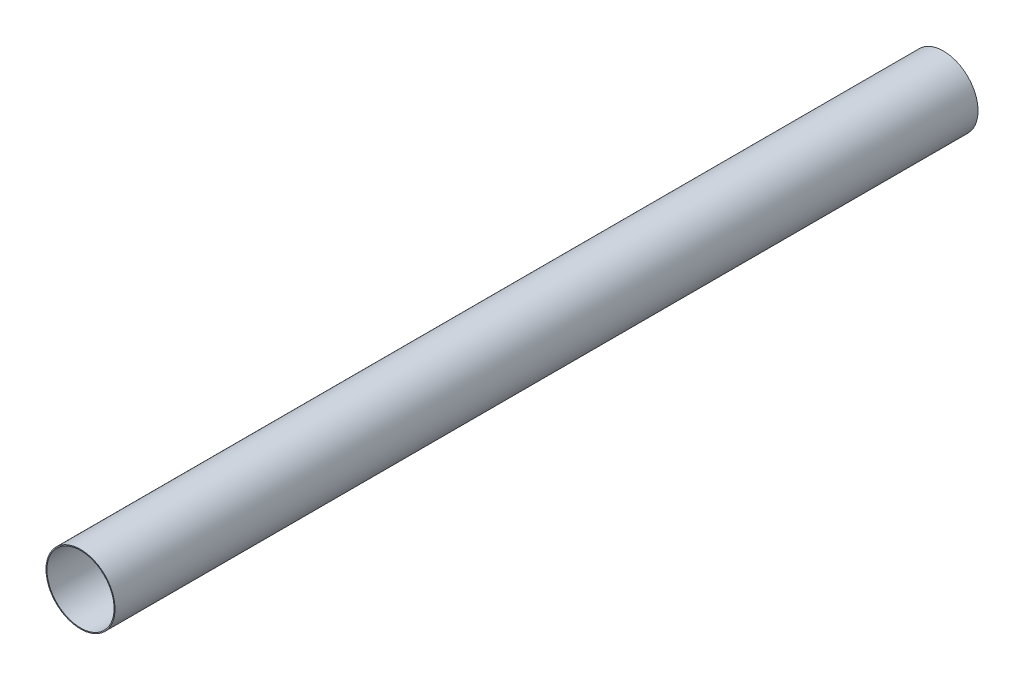
ISO-10303-21;
HEADER;
FILE_DESCRIPTION(('STEP AP214'),'2;1');
FILE_NAME('part.step','',(''),(''),'','','');
FILE_SCHEMA(('AUTOMOTIVE_DESIGN { 1 0 10303 214 1 1 1 1 }'));
ENDSEC;
DATA;
#1=APPLICATION_CONTEXT('core data for automotive mechanical design processes');
#2=APPLICATION_PROTOCOL_DEFINITION('international standard','automotive_design',2000,#1);
#3=PRODUCT_CONTEXT('',#1,'mechanical');
#4=PRODUCT('Part','Part','',(#3));
#5=PRODUCT_RELATED_PRODUCT_CATEGORY('part','',(#4));
#6=PRODUCT_DEFINITION_FORMATION('','',#4);
#7=PRODUCT_DEFINITION_CONTEXT('part definition',#1,'design');
#8=PRODUCT_DEFINITION('design','',#6,#7);
#9=PRODUCT_DEFINITION_SHAPE('','',#8);
#10=(LENGTH_UNIT() NAMED_UNIT(*) SI_UNIT(.MILLI.,.METRE.));
#11=(NAMED_UNIT(*) PLANE_ANGLE_UNIT() SI_UNIT($,.RADIAN.));
#12=(NAMED_UNIT(*) SI_UNIT($,.STERADIAN.) SOLID_ANGLE_UNIT());
#13=UNCERTAINTY_MEASURE_WITH_UNIT(LENGTH_MEASURE(1.E-05),#10,'distance_accuracy_value','');
#14=(GEOMETRIC_REPRESENTATION_CONTEXT(3) GLOBAL_UNCERTAINTY_ASSIGNED_CONTEXT((#13)) GLOBAL_UNIT_ASSIGNED_CONTEXT((#10,
#11,#12)) REPRESENTATION_CONTEXT('',''));
#15=CARTESIAN_POINT('',(0.,0.,0.));
#16=DIRECTION('',(0.,0.,1.));
#17=DIRECTION('',(1.,0.,0.));
#18=AXIS2_PLACEMENT_3D('',#15,#16,#17);
#19=CARTESIAN_POINT('',(0.,0.,1270.));
#20=DIRECTION('',(0.,0.,1.));
#21=DIRECTION('',(1.,0.,0.));
#22=AXIS2_PLACEMENT_3D('',#19,#20,#21);
#23=PLANE('',#22);
#24=CARTESIAN_POINT('',(0.,0.,1270.));
#25=DIRECTION('',(0.,0.,1.));
#26=DIRECTION('',(1.,0.,0.));
#27=AXIS2_PLACEMENT_3D('',#24,#25,#26);
#28=CIRCLE('',#27,50.8);
#29=CARTESIAN_POINT('',(-50.8,0.,1270.));
#30=VERTEX_POINT('',#29);
#31=EDGE_CURVE('E10',#30,#30,#28,.T.);
#32=ORIENTED_EDGE('',*,*,#31,.T.);
#33=EDGE_LOOP('',(#32));
#34=FACE_BOUND('',#33,.T.);
#35=CARTESIAN_POINT('',(0.,0.,1270.));
#36=DIRECTION('',(0.,0.,1.));
#37=DIRECTION('',(1.,0.,0.));
#38=AXIS2_PLACEMENT_3D('',#35,#36,#37);
#39=CIRCLE('',#38,49.403);
#40=CARTESIAN_POINT('',(-49.403,0.,1270.));
#41=VERTEX_POINT('',#40);
#42=EDGE_CURVE('E44',#41,#41,#39,.T.);
#43=ORIENTED_EDGE('',*,*,#42,.F.);
#44=EDGE_LOOP('',(#43));
#45=FACE_BOUND('',#44,.T.);
#46=ADVANCED_FACE('F33',(#34,#45),#23,.T.);
#47=CARTESIAN_POINT('',(0.,0.,0.));
#48=DIRECTION('',(0.,0.,1.));
#49=DIRECTION('',(1.,0.,0.));
#50=AXIS2_PLACEMENT_3D('',#47,#48,#49);
#51=PLANE('',#50);
#52=CARTESIAN_POINT('',(0.,0.,0.));
#53=DIRECTION('',(0.,0.,1.));
#54=DIRECTION('',(1.,0.,0.));
#55=AXIS2_PLACEMENT_3D('',#52,#53,#54);
#56=CIRCLE('',#55,50.8);
#57=CARTESIAN_POINT('',(-50.8,0.,-2.22044604925031E-13));
#58=VERTEX_POINT('',#57);
#59=EDGE_CURVE('E37',#58,#58,#56,.T.);
#60=ORIENTED_EDGE('',*,*,#59,.F.);
#61=EDGE_LOOP('',(#60));
#62=FACE_BOUND('',#61,.T.);
#63=CARTESIAN_POINT('',(0.,0.,0.));
#64=DIRECTION('',(0.,0.,1.));
#65=DIRECTION('',(1.,0.,0.));
#66=AXIS2_PLACEMENT_3D('',#63,#64,#65);
#67=CIRCLE('',#66,49.403);
#68=CARTESIAN_POINT('',(-49.403,0.,-2.22044604925031E-13));
#69=VERTEX_POINT('',#68);
#70=EDGE_CURVE('E46',#69,#69,#67,.T.);
#71=ORIENTED_EDGE('',*,*,#70,.T.);
#72=EDGE_LOOP('',(#71));
#73=FACE_BOUND('',#72,.T.);
#74=ADVANCED_FACE('F56',(#62,#73),#51,.F.);
#75=CARTESIAN_POINT('',(0.,0.,1270.));
#76=DIRECTION('',(0.,0.,-1.));
#77=DIRECTION('',(-1.,0.,0.));
#78=AXIS2_PLACEMENT_3D('',#75,#76,#77);
#79=CYLINDRICAL_SURFACE('',#78,50.8);
#80=CARTESIAN_POINT('',(-50.8,0.,1270.));
#81=CARTESIAN_POINT('',(-50.8,0.,1256.77083333333));
#82=CARTESIAN_POINT('',(-50.8,0.,1243.54166666667));
#83=CARTESIAN_POINT('',(-50.8,0.,1217.08333333333));
#84=CARTESIAN_POINT('',(-50.8,0.,1203.85416666667));
#85=CARTESIAN_POINT('',(-50.8,0.,1177.39583333333));
#86=CARTESIAN_POINT('',(-50.8,0.,1164.16666666667));
#87=CARTESIAN_POINT('',(-50.8,0.,1137.70833333333));
#88=CARTESIAN_POINT('',(-50.8,0.,1124.47916666667));
#89=CARTESIAN_POINT('',(-50.8,0.,1098.02083333333));
#90=CARTESIAN_POINT('',(-50.8,0.,1084.79166666667));
#91=CARTESIAN_POINT('',(-50.8,0.,1058.33333333333));
#92=CARTESIAN_POINT('',(-50.8,0.,1045.10416666667));
#93=CARTESIAN_POINT('',(-50.8,0.,1018.64583333333));
#94=CARTESIAN_POINT('',(-50.8,0.,1005.41666666667));
#95=CARTESIAN_POINT('',(-50.8,0.,978.958333333333));
#96=CARTESIAN_POINT('',(-50.8,0.,965.729166666667));
#97=CARTESIAN_POINT('',(-50.8,0.,939.270833333333));
#98=CARTESIAN_POINT('',(-50.8,0.,926.041666666667));
#99=CARTESIAN_POINT('',(-50.8,0.,899.583333333333));
#100=CARTESIAN_POINT('',(-50.8,0.,886.354166666667));
#101=CARTESIAN_POINT('',(-50.8,0.,859.895833333333));
#102=CARTESIAN_POINT('',(-50.8,0.,846.666666666667));
#103=CARTESIAN_POINT('',(-50.8,0.,820.208333333333));
#104=CARTESIAN_POINT('',(-50.8,0.,806.979166666667));
#105=CARTESIAN_POINT('',(-50.8,0.,780.520833333333));
#106=CARTESIAN_POINT('',(-50.8,0.,767.291666666667));
#107=CARTESIAN_POINT('',(-50.8,0.,740.833333333333));
#108=CARTESIAN_POINT('',(-50.8,0.,727.604166666667));
#109=CARTESIAN_POINT('',(-50.8,0.,701.145833333333));
#110=CARTESIAN_POINT('',(-50.8,0.,687.916666666667));
#111=CARTESIAN_POINT('',(-50.8,0.,661.458333333333));
#112=CARTESIAN_POINT('',(-50.8,0.,648.229166666667));
#113=CARTESIAN_POINT('',(-50.8,0.,621.770833333333));
#114=CARTESIAN_POINT('',(-50.8,0.,608.541666666667));
#115=CARTESIAN_POINT('',(-50.8,0.,582.083333333333));
#116=CARTESIAN_POINT('',(-50.8,0.,568.854166666667));
#117=CARTESIAN_POINT('',(-50.8,0.,542.395833333333));
#118=CARTESIAN_POINT('',(-50.8,0.,529.166666666667));
#119=CARTESIAN_POINT('',(-50.8,0.,502.708333333333));
#120=CARTESIAN_POINT('',(-50.8,0.,489.479166666667));
#121=CARTESIAN_POINT('',(-50.8,0.,463.020833333333));
#122=CARTESIAN_POINT('',(-50.8,0.,449.791666666667));
#123=CARTESIAN_POINT('',(-50.8,0.,423.333333333333));
#124=CARTESIAN_POINT('',(-50.8,0.,410.104166666667));
#125=CARTESIAN_POINT('',(-50.8,0.,383.645833333333));
#126=CARTESIAN_POINT('',(-50.8,0.,370.416666666667));
#127=CARTESIAN_POINT('',(-50.8,0.,343.958333333333));
#128=CARTESIAN_POINT('',(-50.8,0.,330.729166666667));
#129=CARTESIAN_POINT('',(-50.8,0.,304.270833333333));
#130=CARTESIAN_POINT('',(-50.8,0.,291.041666666666));
#131=CARTESIAN_POINT('',(-50.8,0.,264.583333333333));
#132=CARTESIAN_POINT('',(-50.8,0.,251.354166666667));
#133=CARTESIAN_POINT('',(-50.8,0.,224.895833333333));
#134=CARTESIAN_POINT('',(-50.8,0.,211.666666666667));
#135=CARTESIAN_POINT('',(-50.8,0.,185.208333333333));
#136=CARTESIAN_POINT('',(-50.8,0.,171.979166666666));
#137=CARTESIAN_POINT('',(-50.8,0.,145.520833333333));
#138=CARTESIAN_POINT('',(-50.8,0.,132.291666666666));
#139=CARTESIAN_POINT('',(-50.8,0.,105.833333333333));
#140=CARTESIAN_POINT('',(-50.8,0.,92.6041666666664));
#141=CARTESIAN_POINT('',(-50.8,0.,66.1458333333331));
#142=CARTESIAN_POINT('',(-50.8,0.,52.9166666666665));
#143=CARTESIAN_POINT('',(-50.8,0.,26.4583333333332));
#144=CARTESIAN_POINT('',(-50.8,0.,13.2291666666665));
#145=CARTESIAN_POINT('',(-50.8,0.,-2.22044604925031E-13));
#146=B_SPLINE_CURVE_WITH_KNOTS('',3,(#80,#81,#82,#83,#84,#85,#86,#87,#88,#89,#90,#91,#92,#93,
#94,#95,#96,#97,#98,#99,#100,#101,#102,#103,#104,#105,#106,#107,#108,#109,#110,#111,#112,#113,
#114,#115,#116,#117,#118,#119,#120,#121,#122,#123,#124,#125,#126,#127,#128,#129,#130,#131,#132,
#133,#134,#135,#136,#137,#138,#139,#140,#141,#142,#143,#144,#145),.UNSPECIFIED.,.F.,.F.,(4,2,2,
2,2,2,2,2,2,2,2,2,2,2,2,2,2,2,2,2,2,2,2,2,2,2,2,2,2,2,2,2,4),(0.,39.6874999999999,79.375,
119.0625,158.75,198.4375,238.125,277.8125,317.5,357.1875,396.875,436.5625,476.25,515.9375,
555.625,595.3125,635.,674.6875,714.375,754.0625,793.75,833.4375,873.125,912.8125,952.5,992.1875,
1031.875,1071.5625,1111.25,1150.9375,1190.625,1230.3125,1270.),.UNSPECIFIED.);
#147=EDGE_CURVE('BSEAM35',#30,#58,#146,.T.);
#148=ORIENTED_EDGE('',*,*,#31,.F.);
#149=ORIENTED_EDGE('',*,*,#59,.T.);
#150=ORIENTED_EDGE('',*,*,#147,.T.);
#151=ORIENTED_EDGE('',*,*,#147,.F.);
#152=EDGE_LOOP('',(#148,#150,#149,#151));
#153=FACE_BOUND('',#152,.T.);
#154=ADVANCED_FACE('F35',(#153),#79,.T.);
#155=CARTESIAN_POINT('',(0.,0.,1270.));
#156=DIRECTION('',(0.,0.,-1.));
#157=DIRECTION('',(-1.,0.,0.));
#158=AXIS2_PLACEMENT_3D('',#155,#156,#157);
#159=CYLINDRICAL_SURFACE('',#158,49.403);
#160=CARTESIAN_POINT('',(-49.403,0.,1270.));
#161=CARTESIAN_POINT('',(-49.403,0.,1256.77083333333));
#162=CARTESIAN_POINT('',(-49.403,0.,1243.54166666667));
#163=CARTESIAN_POINT('',(-49.403,0.,1217.08333333333));
#164=CARTESIAN_POINT('',(-49.403,0.,1203.85416666667));
#165=CARTESIAN_POINT('',(-49.403,0.,1177.39583333333));
#166=CARTESIAN_POINT('',(-49.403,0.,1164.16666666667));
#167=CARTESIAN_POINT('',(-49.403,0.,1137.70833333333));
#168=CARTESIAN_POINT('',(-49.403,0.,1124.47916666667));
#169=CARTESIAN_POINT('',(-49.403,0.,1098.02083333333));
#170=CARTESIAN_POINT('',(-49.403,0.,1084.79166666667));
#171=CARTESIAN_POINT('',(-49.403,0.,1058.33333333333));
#172=CARTESIAN_POINT('',(-49.403,0.,1045.10416666667));
#173=CARTESIAN_POINT('',(-49.403,0.,1018.64583333333));
#174=CARTESIAN_POINT('',(-49.403,0.,1005.41666666667));
#175=CARTESIAN_POINT('',(-49.403,0.,978.958333333333));
#176=CARTESIAN_POINT('',(-49.403,0.,965.729166666667));
#177=CARTESIAN_POINT('',(-49.403,0.,939.270833333333));
#178=CARTESIAN_POINT('',(-49.403,0.,926.041666666667));
#179=CARTESIAN_POINT('',(-49.403,0.,899.583333333333));
#180=CARTESIAN_POINT('',(-49.403,0.,886.354166666666));
#181=CARTESIAN_POINT('',(-49.403,0.,859.895833333333));
#182=CARTESIAN_POINT('',(-49.403,0.,846.666666666666));
#183=CARTESIAN_POINT('',(-49.403,0.,820.208333333333));
#184=CARTESIAN_POINT('',(-49.403,0.,806.979166666667));
#185=CARTESIAN_POINT('',(-49.403,0.,780.520833333333));
#186=CARTESIAN_POINT('',(-49.403,0.,767.291666666667));
#187=CARTESIAN_POINT('',(-49.403,0.,740.833333333333));
#188=CARTESIAN_POINT('',(-49.403,0.,727.604166666667));
#189=CARTESIAN_POINT('',(-49.403,0.,701.145833333333));
#190=CARTESIAN_POINT('',(-49.403,0.,687.916666666666));
#191=CARTESIAN_POINT('',(-49.403,0.,661.458333333333));
#192=CARTESIAN_POINT('',(-49.403,0.,648.229166666666));
#193=CARTESIAN_POINT('',(-49.403,0.,621.770833333333));
#194=CARTESIAN_POINT('',(-49.403,0.,608.541666666666));
#195=CARTESIAN_POINT('',(-49.403,0.,582.083333333333));
#196=CARTESIAN_POINT('',(-49.403,0.,568.854166666666));
#197=CARTESIAN_POINT('',(-49.403,0.,542.395833333333));
#198=CARTESIAN_POINT('',(-49.403,0.,529.166666666666));
#199=CARTESIAN_POINT('',(-49.403,0.,502.708333333333));
#200=CARTESIAN_POINT('',(-49.403,0.,489.479166666666));
#201=CARTESIAN_POINT('',(-49.403,0.,463.020833333333));
#202=CARTESIAN_POINT('',(-49.403,0.,449.791666666666));
#203=CARTESIAN_POINT('',(-49.403,0.,423.333333333333));
#204=CARTESIAN_POINT('',(-49.403,0.,410.104166666666));
#205=CARTESIAN_POINT('',(-49.403,0.,383.645833333333));
#206=CARTESIAN_POINT('',(-49.403,0.,370.416666666666));
#207=CARTESIAN_POINT('',(-49.403,0.,343.958333333333));
#208=CARTESIAN_POINT('',(-49.403,0.,330.729166666666));
#209=CARTESIAN_POINT('',(-49.403,0.,304.270833333333));
#210=CARTESIAN_POINT('',(-49.403,0.,291.041666666666));
#211=CARTESIAN_POINT('',(-49.403,0.,264.583333333333));
#212=CARTESIAN_POINT('',(-49.403,0.,251.354166666666));
#213=CARTESIAN_POINT('',(-49.403,0.,224.895833333333));
#214=CARTESIAN_POINT('',(-49.403,0.,211.666666666667));
#215=CARTESIAN_POINT('',(-49.403,0.,185.208333333333));
#216=CARTESIAN_POINT('',(-49.403,0.,171.979166666666));
#217=CARTESIAN_POINT('',(-49.403,0.,145.520833333333));
#218=CARTESIAN_POINT('',(-49.403,0.,132.291666666666));
#219=CARTESIAN_POINT('',(-49.403,0.,105.833333333333));
#220=CARTESIAN_POINT('',(-49.403,0.,92.6041666666664));
#221=CARTESIAN_POINT('',(-49.403,0.,66.1458333333331));
#222=CARTESIAN_POINT('',(-49.403,0.,52.9166666666665));
#223=CARTESIAN_POINT('',(-49.403,0.,26.4583333333332));
#224=CARTESIAN_POINT('',(-49.403,0.,13.2291666666665));
#225=CARTESIAN_POINT('',(-49.403,0.,-2.22044604925031E-13));
#226=B_SPLINE_CURVE_WITH_KNOTS('',3,(#160,#161,#162,#163,#164,#165,#166,#167,#168,#169,#170,
#171,#172,#173,#174,#175,#176,#177,#178,#179,#180,#181,#182,#183,#184,#185,#186,#187,#188,#189,
#190,#191,#192,#193,#194,#195,#196,#197,#198,#199,#200,#201,#202,#203,#204,#205,#206,#207,#208,
#209,#210,#211,#212,#213,#214,#215,#216,#217,#218,#219,#220,#221,#222,#223,#224,#225),
.UNSPECIFIED.,.F.,.F.,(4,2,2,2,2,2,2,2,2,2,2,2,2,2,2,2,2,2,2,2,2,2,2,2,2,2,2,2,2,2,2,2,4),(0.,
39.6875000000001,79.3750000000002,119.0625,158.75,198.4375,238.125,277.8125,317.5,357.1875,
396.875,436.5625,476.25,515.9375,555.625,595.3125,635.,674.6875,714.375,754.0625,793.75,
833.4375,873.125,912.8125,952.5,992.1875,1031.875,1071.5625,1111.25,1150.9375,1190.625,
1230.3125,1270.),.UNSPECIFIED.);
#227=EDGE_CURVE('BSEAM52',#41,#69,#226,.T.);
#228=ORIENTED_EDGE('',*,*,#42,.T.);
#229=ORIENTED_EDGE('',*,*,#70,.F.);
#230=ORIENTED_EDGE('',*,*,#227,.T.);
#231=ORIENTED_EDGE('',*,*,#227,.F.);
#232=EDGE_LOOP('',(#228,#230,#229,#231));
#233=FACE_BOUND('',#232,.T.);
#234=ADVANCED_FACE('F52',(#233),#159,.F.);
#235=CLOSED_SHELL('',(#46,#74,#154,#234));
#236=MANIFOLD_SOLID_BREP('B2',#235);
#237=ADVANCED_BREP_SHAPE_REPRESENTATION('',(#18,#236),#14);
#238=SHAPE_DEFINITION_REPRESENTATION(#9,#237);
ENDSEC;
END-ISO-10303-21;
